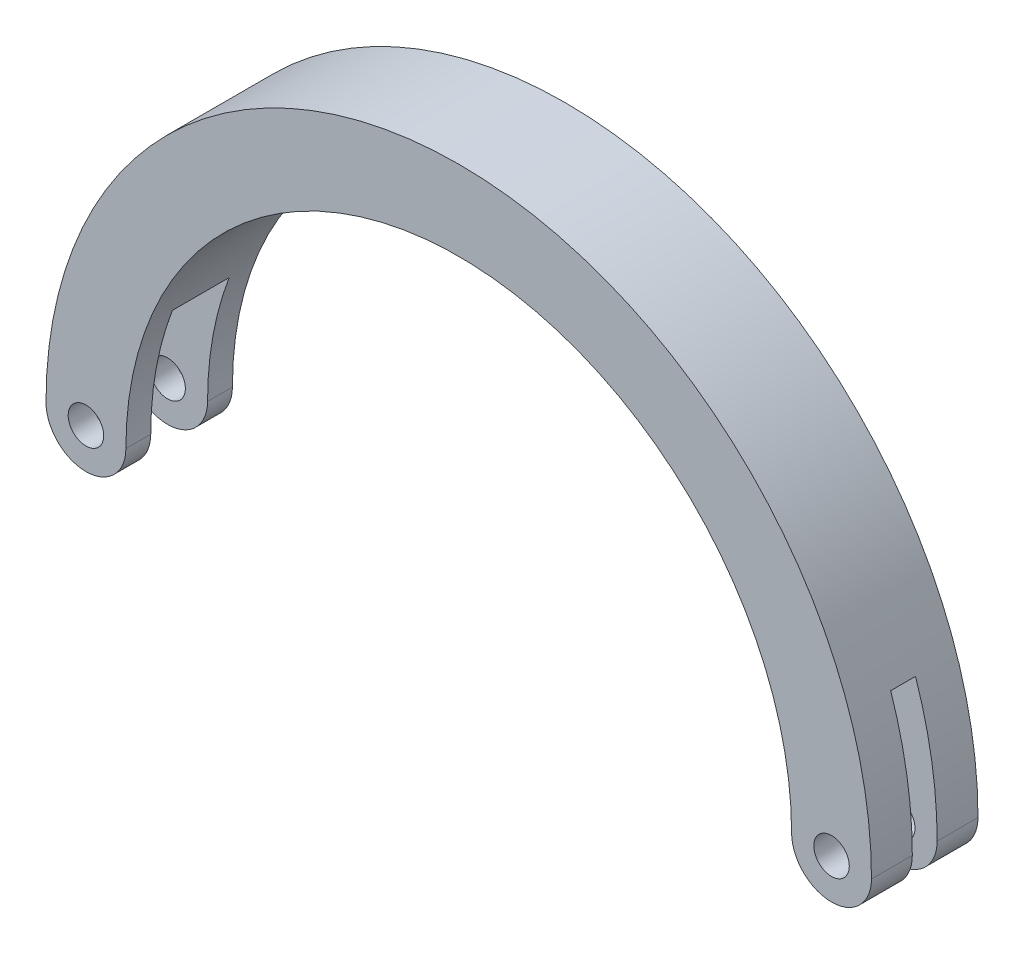
ISO-10303-21;
HEADER;
FILE_DESCRIPTION(('STEP AP214'),'2;1');
FILE_NAME('part.step','',(''),(''),'','','');
FILE_SCHEMA(('AUTOMOTIVE_DESIGN { 1 0 10303 214 1 1 1 1 }'));
ENDSEC;
DATA;
#1=APPLICATION_CONTEXT('core data for automotive mechanical design processes');
#2=APPLICATION_PROTOCOL_DEFINITION('international standard','automotive_design',2000,#1);
#3=PRODUCT_CONTEXT('',#1,'mechanical');
#4=PRODUCT('Part','Part','',(#3));
#5=PRODUCT_RELATED_PRODUCT_CATEGORY('part','',(#4));
#6=PRODUCT_DEFINITION_FORMATION('','',#4);
#7=PRODUCT_DEFINITION_CONTEXT('part definition',#1,'design');
#8=PRODUCT_DEFINITION('design','',#6,#7);
#9=PRODUCT_DEFINITION_SHAPE('','',#8);
#10=(LENGTH_UNIT() NAMED_UNIT(*) SI_UNIT(.MILLI.,.METRE.));
#11=(NAMED_UNIT(*) PLANE_ANGLE_UNIT() SI_UNIT($,.RADIAN.));
#12=(NAMED_UNIT(*) SI_UNIT($,.STERADIAN.) SOLID_ANGLE_UNIT());
#13=UNCERTAINTY_MEASURE_WITH_UNIT(LENGTH_MEASURE(1.E-05),#10,'distance_accuracy_value','');
#14=(GEOMETRIC_REPRESENTATION_CONTEXT(3) GLOBAL_UNCERTAINTY_ASSIGNED_CONTEXT((#13)) GLOBAL_UNIT_ASSIGNED_CONTEXT((#10,
#11,#12)) REPRESENTATION_CONTEXT('',''));
#15=CARTESIAN_POINT('',(0.,0.,0.));
#16=DIRECTION('',(0.,0.,1.));
#17=DIRECTION('',(1.,0.,0.));
#18=AXIS2_PLACEMENT_3D('',#15,#16,#17);
#19=CARTESIAN_POINT('',(42.,0.,-3.));
#20=DIRECTION('',(0.,0.,1.));
#21=DIRECTION('',(1.,0.,0.));
#22=AXIS2_PLACEMENT_3D('',#19,#20,#21);
#23=CYLINDRICAL_SURFACE('',#22,2.25);
#24=DIRECTION('',(0.,0.,1.));
#25=VECTOR('',#24,1.);
#26=CARTESIAN_POINT('',(44.25,0.,-3.));
#27=LINE('',#26,#25);
#28=CARTESIAN_POINT('',(44.25,0.,-3.));
#29=VERTEX_POINT('',#28);
#30=CARTESIAN_POINT('',(44.25,0.,-0.7));
#31=VERTEX_POINT('',#30);
#32=EDGE_CURVE('E217',#29,#31,#27,.T.);
#33=ORIENTED_EDGE('',*,*,#32,.T.);
#34=CARTESIAN_POINT('',(42.,0.,-0.7));
#35=DIRECTION('',(0.,0.,1.));
#36=DIRECTION('',(1.,0.,0.));
#37=AXIS2_PLACEMENT_3D('',#34,#35,#36);
#38=CIRCLE('',#37,2.25);
#39=CARTESIAN_POINT('',(39.75,0.,-0.7));
#40=VERTEX_POINT('',#39);
#41=EDGE_CURVE('E130',#31,#40,#38,.F.);
#42=ORIENTED_EDGE('',*,*,#41,.T.);
#43=DIRECTION('',(0.,0.,1.));
#44=VECTOR('',#43,1.);
#45=CARTESIAN_POINT('',(39.75,0.,-3.));
#46=LINE('',#45,#44);
#47=CARTESIAN_POINT('',(39.75,0.,-3.));
#48=VERTEX_POINT('',#47);
#49=EDGE_CURVE('E220',#48,#40,#46,.T.);
#50=ORIENTED_EDGE('',*,*,#49,.F.);
#51=CARTESIAN_POINT('',(42.,0.,-3.));
#52=DIRECTION('',(0.,0.,1.));
#53=DIRECTION('',(1.,0.,0.));
#54=AXIS2_PLACEMENT_3D('',#51,#52,#53);
#55=CIRCLE('',#54,2.25);
#56=EDGE_CURVE('E200',#48,#29,#55,.T.);
#57=ORIENTED_EDGE('',*,*,#56,.T.);
#58=EDGE_LOOP('',(#33,#42,#50,#57));
#59=FACE_BOUND('',#58,.T.);
#60=ADVANCED_FACE('F40',(#59),#23,.T.);
#61=CARTESIAN_POINT('',(42.,0.,-3.));
#62=DIRECTION('',(0.,0.,1.));
#63=DIRECTION('',(1.,0.,0.));
#64=AXIS2_PLACEMENT_3D('',#61,#62,#63);
#65=CYLINDRICAL_SURFACE('',#64,0.999999999999998);
#66=CARTESIAN_POINT('',(42.,0.,-3.));
#67=DIRECTION('',(0.,0.,1.));
#68=DIRECTION('',(1.,0.,0.));
#69=AXIS2_PLACEMENT_3D('',#66,#67,#68);
#70=CIRCLE('',#69,0.999999999999998);
#71=CARTESIAN_POINT('',(43.,0.,-3.));
#72=VERTEX_POINT('',#71);
#73=EDGE_CURVE('E208',#72,#72,#70,.T.);
#74=ORIENTED_EDGE('',*,*,#73,.F.);
#75=EDGE_LOOP('',(#74));
#76=FACE_BOUND('',#75,.T.);
#77=CARTESIAN_POINT('',(42.,0.,-0.7));
#78=DIRECTION('',(0.,0.,1.));
#79=DIRECTION('',(1.,0.,0.));
#80=AXIS2_PLACEMENT_3D('',#77,#78,#79);
#81=CIRCLE('',#80,0.999999999999998);
#82=CARTESIAN_POINT('',(43.,0.,-0.7));
#83=VERTEX_POINT('',#82);
#84=EDGE_CURVE('E232',#83,#83,#81,.F.);
#85=ORIENTED_EDGE('',*,*,#84,.F.);
#86=EDGE_LOOP('',(#85));
#87=FACE_BOUND('',#86,.T.);
#88=ADVANCED_FACE('F294',(#76,#87),#65,.F.);
#89=CARTESIAN_POINT('',(0.,0.,-3.));
#90=DIRECTION('',(0.,0.,1.));
#91=DIRECTION('',(1.,0.,0.));
#92=AXIS2_PLACEMENT_3D('',#89,#90,#91);
#93=CYLINDRICAL_SURFACE('',#92,2.25);
#94=DIRECTION('',(0.,0.,1.));
#95=VECTOR('',#94,1.);
#96=CARTESIAN_POINT('',(2.25,0.,-3.));
#97=LINE('',#96,#95);
#98=CARTESIAN_POINT('',(2.25,0.,-3.));
#99=VERTEX_POINT('',#98);
#100=CARTESIAN_POINT('',(2.25,0.,-1.6));
#101=VERTEX_POINT('',#100);
#102=EDGE_CURVE('E224',#99,#101,#97,.T.);
#103=ORIENTED_EDGE('',*,*,#102,.T.);
#104=CARTESIAN_POINT('',(0.,0.,-1.6));
#105=DIRECTION('',(0.,0.,1.));
#106=DIRECTION('',(1.,0.,0.));
#107=AXIS2_PLACEMENT_3D('',#104,#105,#106);
#108=CIRCLE('',#107,2.25);
#109=CARTESIAN_POINT('',(-2.25,0.,-1.6));
#110=VERTEX_POINT('',#109);
#111=EDGE_CURVE('E63',#101,#110,#108,.F.);
#112=ORIENTED_EDGE('',*,*,#111,.T.);
#113=DIRECTION('',(0.,0.,1.));
#114=VECTOR('',#113,1.);
#115=CARTESIAN_POINT('',(-2.25,0.,-3.));
#116=LINE('',#115,#114);
#117=CARTESIAN_POINT('',(-2.25,0.,-3.));
#118=VERTEX_POINT('',#117);
#119=EDGE_CURVE('E212',#118,#110,#116,.T.);
#120=ORIENTED_EDGE('',*,*,#119,.F.);
#121=CARTESIAN_POINT('',(0.,0.,-3.));
#122=DIRECTION('',(0.,0.,1.));
#123=DIRECTION('',(1.,0.,0.));
#124=AXIS2_PLACEMENT_3D('',#121,#122,#123);
#125=CIRCLE('',#124,2.25);
#126=EDGE_CURVE('E194',#118,#99,#125,.T.);
#127=ORIENTED_EDGE('',*,*,#126,.T.);
#128=EDGE_LOOP('',(#103,#112,#120,#127));
#129=FACE_BOUND('',#128,.T.);
#130=ADVANCED_FACE('F258',(#129),#93,.T.);
#131=CARTESIAN_POINT('',(0.,0.,-3.));
#132=DIRECTION('',(0.,0.,1.));
#133=DIRECTION('',(1.,0.,0.));
#134=AXIS2_PLACEMENT_3D('',#131,#132,#133);
#135=CYLINDRICAL_SURFACE('',#134,1.);
#136=CARTESIAN_POINT('',(0.,0.,-3.));
#137=DIRECTION('',(0.,0.,1.));
#138=DIRECTION('',(1.,0.,0.));
#139=AXIS2_PLACEMENT_3D('',#136,#137,#138);
#140=CIRCLE('',#139,1.);
#141=CARTESIAN_POINT('',(1.,0.,-3.));
#142=VERTEX_POINT('',#141);
#143=EDGE_CURVE('E205',#142,#142,#140,.T.);
#144=ORIENTED_EDGE('',*,*,#143,.F.);
#145=EDGE_LOOP('',(#144));
#146=FACE_BOUND('',#145,.T.);
#147=CARTESIAN_POINT('',(0.,0.,-1.6));
#148=DIRECTION('',(0.,0.,1.));
#149=DIRECTION('',(1.,0.,0.));
#150=AXIS2_PLACEMENT_3D('',#147,#148,#149);
#151=CIRCLE('',#150,1.);
#152=CARTESIAN_POINT('',(1.,0.,-1.6));
#153=VERTEX_POINT('',#152);
#154=EDGE_CURVE('E163',#153,#153,#151,.F.);
#155=ORIENTED_EDGE('',*,*,#154,.F.);
#156=EDGE_LOOP('',(#155));
#157=FACE_BOUND('',#156,.T.);
#158=ADVANCED_FACE('F311',(#146,#157),#135,.F.);
#159=CARTESIAN_POINT('',(0.,0.,1.6));
#160=DIRECTION('',(0.,0.,1.));
#161=DIRECTION('',(1.,0.,0.));
#162=AXIS2_PLACEMENT_3D('',#159,#160,#161);
#163=CIRCLE('',#162,2.25);
#164=CARTESIAN_POINT('',(2.25,0.,1.6));
#165=VERTEX_POINT('',#164);
#166=CARTESIAN_POINT('',(-2.25,0.,1.6));
#167=VERTEX_POINT('',#166);
#168=EDGE_CURVE('E166',#165,#167,#163,.F.);
#169=ORIENTED_EDGE('',*,*,#168,.F.);
#170=CARTESIAN_POINT('',(2.25,0.,3.));
#171=VERTEX_POINT('',#170);
#172=EDGE_CURVE('E211',#165,#171,#97,.T.);
#173=ORIENTED_EDGE('',*,*,#172,.T.);
#174=CARTESIAN_POINT('',(0.,0.,3.));
#175=DIRECTION('',(0.,0.,1.));
#176=DIRECTION('',(1.,0.,0.));
#177=AXIS2_PLACEMENT_3D('',#174,#175,#176);
#178=CIRCLE('',#177,2.25);
#179=CARTESIAN_POINT('',(-2.25,0.,3.));
#180=VERTEX_POINT('',#179);
#181=EDGE_CURVE('E176',#180,#171,#178,.T.);
#182=ORIENTED_EDGE('',*,*,#181,.F.);
#183=EDGE_CURVE('E216',#167,#180,#116,.T.);
#184=ORIENTED_EDGE('',*,*,#183,.F.);
#185=EDGE_LOOP('',(#169,#173,#182,#184));
#186=FACE_BOUND('',#185,.T.);
#187=ADVANCED_FACE('F42',(#186),#93,.T.);
#188=CARTESIAN_POINT('',(21.,0.,-3.));
#189=DIRECTION('',(0.,0.,1.));
#190=DIRECTION('',(1.,0.,0.));
#191=AXIS2_PLACEMENT_3D('',#188,#189,#190);
#192=CYLINDRICAL_SURFACE('',#191,23.25);
#193=CARTESIAN_POINT('',(44.25,0.,0.7));
#194=VERTEX_POINT('',#193);
#195=CARTESIAN_POINT('',(44.25,0.,3.));
#196=VERTEX_POINT('',#195);
#197=EDGE_CURVE('E219',#194,#196,#27,.T.);
#198=ORIENTED_EDGE('',*,*,#197,.F.);
#199=CARTESIAN_POINT('',(21.,0.,0.7));
#200=DIRECTION('',(0.,0.,1.));
#201=DIRECTION('',(1.,0.,0.));
#202=AXIS2_PLACEMENT_3D('',#199,#200,#201);
#203=CIRCLE('',#202,23.25);
#204=CARTESIAN_POINT('',(43.03125,7.42876325087158,0.7));
#205=VERTEX_POINT('',#204);
#206=EDGE_CURVE('E148',#194,#205,#203,.T.);
#207=ORIENTED_EDGE('',*,*,#206,.T.);
#208=DIRECTION('',(0.,0.,-1.));
#209=VECTOR('',#208,1.);
#210=CARTESIAN_POINT('',(43.03125,7.42876325087158,0.));
#211=LINE('',#210,#209);
#212=CARTESIAN_POINT('',(43.03125,7.42876325087158,-0.7));
#213=VERTEX_POINT('',#212);
#214=EDGE_CURVE('E140',#213,#205,#211,.F.);
#215=ORIENTED_EDGE('',*,*,#214,.F.);
#216=CARTESIAN_POINT('',(21.,0.,-0.7));
#217=DIRECTION('',(0.,0.,1.));
#218=DIRECTION('',(1.,0.,0.));
#219=AXIS2_PLACEMENT_3D('',#216,#217,#218);
#220=CIRCLE('',#219,23.25);
#221=EDGE_CURVE('E127',#31,#213,#220,.T.);
#222=ORIENTED_EDGE('',*,*,#221,.F.);
#223=ORIENTED_EDGE('',*,*,#32,.F.);
#224=CARTESIAN_POINT('',(21.,0.,-3.));
#225=DIRECTION('',(0.,0.,1.));
#226=DIRECTION('',(1.,0.,0.));
#227=AXIS2_PLACEMENT_3D('',#224,#225,#226);
#228=CIRCLE('',#227,23.25);
#229=EDGE_CURVE('E203',#118,#29,#228,.F.);
#230=ORIENTED_EDGE('',*,*,#229,.F.);
#231=ORIENTED_EDGE('',*,*,#119,.T.);
#232=CARTESIAN_POINT('',(21.,0.,-1.6));
#233=DIRECTION('',(0.,0.,1.));
#234=DIRECTION('',(1.,0.,0.));
#235=AXIS2_PLACEMENT_3D('',#232,#233,#234);
#236=CIRCLE('',#235,23.25);
#237=CARTESIAN_POINT('',(-1.03125,7.42876325087157,-1.6));
#238=VERTEX_POINT('',#237);
#239=EDGE_CURVE('E161',#238,#110,#236,.T.);
#240=ORIENTED_EDGE('',*,*,#239,.F.);
#241=DIRECTION('',(0.,0.,-1.));
#242=VECTOR('',#241,1.);
#243=CARTESIAN_POINT('',(-1.03125,7.42876325087157,0.));
#244=LINE('',#243,#242);
#245=CARTESIAN_POINT('',(-1.03125,7.42876325087157,1.6));
#246=VERTEX_POINT('',#245);
#247=EDGE_CURVE('E174',#246,#238,#244,.T.);
#248=ORIENTED_EDGE('',*,*,#247,.F.);
#249=CARTESIAN_POINT('',(21.,0.,1.6));
#250=DIRECTION('',(0.,0.,1.));
#251=DIRECTION('',(1.,0.,0.));
#252=AXIS2_PLACEMENT_3D('',#249,#250,#251);
#253=CIRCLE('',#252,23.25);
#254=EDGE_CURVE('E168',#246,#167,#253,.T.);
#255=ORIENTED_EDGE('',*,*,#254,.T.);
#256=ORIENTED_EDGE('',*,*,#183,.T.);
#257=CARTESIAN_POINT('',(21.,0.,3.));
#258=DIRECTION('',(0.,0.,1.));
#259=DIRECTION('',(1.,0.,0.));
#260=AXIS2_PLACEMENT_3D('',#257,#258,#259);
#261=CIRCLE('',#260,23.25);
#262=EDGE_CURVE('E185',#180,#196,#261,.F.);
#263=ORIENTED_EDGE('',*,*,#262,.T.);
#264=EDGE_LOOP('',(#198,#207,#215,#222,#223,#230,#231,#240,#248,#255,#256,#263));
#265=FACE_BOUND('',#264,.T.);
#266=ADVANCED_FACE('F147',(#265),#192,.T.);
#267=CARTESIAN_POINT('',(42.,0.,0.7));
#268=DIRECTION('',(0.,0.,1.));
#269=DIRECTION('',(1.,0.,0.));
#270=AXIS2_PLACEMENT_3D('',#267,#268,#269);
#271=CIRCLE('',#270,2.25);
#272=CARTESIAN_POINT('',(39.75,0.,0.7));
#273=VERTEX_POINT('',#272);
#274=EDGE_CURVE('E154',#194,#273,#271,.F.);
#275=ORIENTED_EDGE('',*,*,#274,.F.);
#276=ORIENTED_EDGE('',*,*,#197,.T.);
#277=CARTESIAN_POINT('',(42.,0.,3.));
#278=DIRECTION('',(0.,0.,1.));
#279=DIRECTION('',(1.,0.,0.));
#280=AXIS2_PLACEMENT_3D('',#277,#278,#279);
#281=CIRCLE('',#280,2.25);
#282=CARTESIAN_POINT('',(39.75,0.,3.));
#283=VERTEX_POINT('',#282);
#284=EDGE_CURVE('E182',#283,#196,#281,.T.);
#285=ORIENTED_EDGE('',*,*,#284,.F.);
#286=EDGE_CURVE('E223',#273,#283,#46,.T.);
#287=ORIENTED_EDGE('',*,*,#286,.F.);
#288=EDGE_LOOP('',(#275,#276,#285,#287));
#289=FACE_BOUND('',#288,.T.);
#290=ADVANCED_FACE('F281',(#289),#23,.T.);
#291=CARTESIAN_POINT('',(0.,0.,1.6));
#292=DIRECTION('',(0.,0.,1.));
#293=DIRECTION('',(1.,0.,0.));
#294=AXIS2_PLACEMENT_3D('',#291,#292,#293);
#295=CIRCLE('',#294,1.);
#296=CARTESIAN_POINT('',(1.,0.,1.6));
#297=VERTEX_POINT('',#296);
#298=EDGE_CURVE('E171',#297,#297,#295,.F.);
#299=ORIENTED_EDGE('',*,*,#298,.T.);
#300=EDGE_LOOP('',(#299));
#301=FACE_BOUND('',#300,.T.);
#302=CARTESIAN_POINT('',(0.,0.,3.));
#303=DIRECTION('',(0.,0.,1.));
#304=DIRECTION('',(1.,0.,0.));
#305=AXIS2_PLACEMENT_3D('',#302,#303,#304);
#306=CIRCLE('',#305,1.);
#307=CARTESIAN_POINT('',(1.,0.,3.));
#308=VERTEX_POINT('',#307);
#309=EDGE_CURVE('E188',#308,#308,#306,.T.);
#310=ORIENTED_EDGE('',*,*,#309,.T.);
#311=EDGE_LOOP('',(#310));
#312=FACE_BOUND('',#311,.T.);
#313=ADVANCED_FACE('F304',(#301,#312),#135,.F.);
#314=CARTESIAN_POINT('',(21.,0.,-3.));
#315=DIRECTION('',(0.,0.,1.));
#316=DIRECTION('',(1.,0.,0.));
#317=AXIS2_PLACEMENT_3D('',#314,#315,#316);
#318=CYLINDRICAL_SURFACE('',#317,18.75);
#319=CARTESIAN_POINT('',(21.,0.,0.7));
#320=DIRECTION('',(0.,0.,1.));
#321=DIRECTION('',(1.,0.,0.));
#322=AXIS2_PLACEMENT_3D('',#319,#320,#321);
#323=CIRCLE('',#322,18.75);
#324=CARTESIAN_POINT('',(38.53125,6.64964460986451,0.7));
#325=VERTEX_POINT('',#324);
#326=EDGE_CURVE('E236',#273,#325,#323,.T.);
#327=ORIENTED_EDGE('',*,*,#326,.F.);
#328=ORIENTED_EDGE('',*,*,#286,.T.);
#329=CARTESIAN_POINT('',(21.,0.,3.));
#330=DIRECTION('',(0.,0.,1.));
#331=DIRECTION('',(1.,0.,0.));
#332=AXIS2_PLACEMENT_3D('',#329,#330,#331);
#333=CIRCLE('',#332,18.75);
#334=EDGE_CURVE('E179',#171,#283,#333,.F.);
#335=ORIENTED_EDGE('',*,*,#334,.F.);
#336=ORIENTED_EDGE('',*,*,#172,.F.);
#337=CARTESIAN_POINT('',(21.,0.,1.6));
#338=DIRECTION('',(0.,0.,1.));
#339=DIRECTION('',(1.,0.,0.));
#340=AXIS2_PLACEMENT_3D('',#337,#338,#339);
#341=CIRCLE('',#340,18.75);
#342=CARTESIAN_POINT('',(3.46875,6.6496446098645,1.6));
#343=VERTEX_POINT('',#342);
#344=EDGE_CURVE('E48',#343,#165,#341,.T.);
#345=ORIENTED_EDGE('',*,*,#344,.F.);
#346=DIRECTION('',(0.,0.,-1.));
#347=VECTOR('',#346,1.);
#348=CARTESIAN_POINT('',(3.46875,6.6496446098645,0.));
#349=LINE('',#348,#347);
#350=CARTESIAN_POINT('',(3.46875,6.6496446098645,-1.6));
#351=VERTEX_POINT('',#350);
#352=EDGE_CURVE('E228',#343,#351,#349,.T.);
#353=ORIENTED_EDGE('',*,*,#352,.T.);
#354=CARTESIAN_POINT('',(21.,0.,-1.6));
#355=DIRECTION('',(0.,0.,1.));
#356=DIRECTION('',(1.,0.,0.));
#357=AXIS2_PLACEMENT_3D('',#354,#355,#356);
#358=CIRCLE('',#357,18.75);
#359=EDGE_CURVE('E215',#351,#101,#358,.T.);
#360=ORIENTED_EDGE('',*,*,#359,.T.);
#361=ORIENTED_EDGE('',*,*,#102,.F.);
#362=CARTESIAN_POINT('',(21.,0.,-3.));
#363=DIRECTION('',(0.,0.,1.));
#364=DIRECTION('',(1.,0.,0.));
#365=AXIS2_PLACEMENT_3D('',#362,#363,#364);
#366=CIRCLE('',#365,18.75);
#367=EDGE_CURVE('E197',#99,#48,#366,.F.);
#368=ORIENTED_EDGE('',*,*,#367,.T.);
#369=ORIENTED_EDGE('',*,*,#49,.T.);
#370=CARTESIAN_POINT('',(21.,0.,-0.7));
#371=DIRECTION('',(0.,0.,1.));
#372=DIRECTION('',(1.,0.,0.));
#373=AXIS2_PLACEMENT_3D('',#370,#371,#372);
#374=CIRCLE('',#373,18.75);
#375=CARTESIAN_POINT('',(38.53125,6.64964460986451,-0.7));
#376=VERTEX_POINT('',#375);
#377=EDGE_CURVE('E234',#40,#376,#374,.T.);
#378=ORIENTED_EDGE('',*,*,#377,.T.);
#379=DIRECTION('',(0.,0.,-1.));
#380=VECTOR('',#379,1.);
#381=CARTESIAN_POINT('',(38.53125,6.64964460986451,0.));
#382=LINE('',#381,#380);
#383=EDGE_CURVE('E11',#376,#325,#382,.F.);
#384=ORIENTED_EDGE('',*,*,#383,.T.);
#385=EDGE_LOOP('',(#327,#328,#335,#336,#345,#353,#360,#361,#368,#369,#378,#384));
#386=FACE_BOUND('',#385,.T.);
#387=ADVANCED_FACE('F246',(#386),#318,.F.);
#388=CARTESIAN_POINT('',(42.,0.,0.7));
#389=DIRECTION('',(0.,0.,1.));
#390=DIRECTION('',(1.,0.,0.));
#391=AXIS2_PLACEMENT_3D('',#388,#389,#390);
#392=CIRCLE('',#391,0.999999999999998);
#393=CARTESIAN_POINT('',(43.,0.,0.7));
#394=VERTEX_POINT('',#393);
#395=EDGE_CURVE('E135',#394,#394,#392,.F.);
#396=ORIENTED_EDGE('',*,*,#395,.T.);
#397=EDGE_LOOP('',(#396));
#398=FACE_BOUND('',#397,.T.);
#399=CARTESIAN_POINT('',(42.,0.,3.));
#400=DIRECTION('',(0.,0.,1.));
#401=DIRECTION('',(1.,0.,0.));
#402=AXIS2_PLACEMENT_3D('',#399,#400,#401);
#403=CIRCLE('',#402,0.999999999999998);
#404=CARTESIAN_POINT('',(43.,0.,3.));
#405=VERTEX_POINT('',#404);
#406=EDGE_CURVE('E191',#405,#405,#403,.T.);
#407=ORIENTED_EDGE('',*,*,#406,.T.);
#408=EDGE_LOOP('',(#407));
#409=FACE_BOUND('',#408,.T.);
#410=ADVANCED_FACE('F301',(#398,#409),#65,.F.);
#411=CARTESIAN_POINT('',(0.,0.,-3.));
#412=DIRECTION('',(0.,0.,1.));
#413=DIRECTION('',(1.,0.,0.));
#414=AXIS2_PLACEMENT_3D('',#411,#412,#413);
#415=PLANE('',#414);
#416=ORIENTED_EDGE('',*,*,#126,.F.);
#417=ORIENTED_EDGE('',*,*,#229,.T.);
#418=ORIENTED_EDGE('',*,*,#56,.F.);
#419=ORIENTED_EDGE('',*,*,#367,.F.);
#420=EDGE_LOOP('',(#416,#417,#418,#419));
#421=FACE_BOUND('',#420,.T.);
#422=ORIENTED_EDGE('',*,*,#143,.T.);
#423=EDGE_LOOP('',(#422));
#424=FACE_BOUND('',#423,.T.);
#425=ORIENTED_EDGE('',*,*,#73,.T.);
#426=EDGE_LOOP('',(#425));
#427=FACE_BOUND('',#426,.T.);
#428=ADVANCED_FACE('F255',(#421,#424,#427),#415,.F.);
#429=CARTESIAN_POINT('',(0.,0.,3.));
#430=DIRECTION('',(0.,0.,1.));
#431=DIRECTION('',(1.,0.,0.));
#432=AXIS2_PLACEMENT_3D('',#429,#430,#431);
#433=PLANE('',#432);
#434=ORIENTED_EDGE('',*,*,#181,.T.);
#435=ORIENTED_EDGE('',*,*,#334,.T.);
#436=ORIENTED_EDGE('',*,*,#284,.T.);
#437=ORIENTED_EDGE('',*,*,#262,.F.);
#438=EDGE_LOOP('',(#434,#435,#436,#437));
#439=FACE_BOUND('',#438,.T.);
#440=ORIENTED_EDGE('',*,*,#309,.F.);
#441=EDGE_LOOP('',(#440));
#442=FACE_BOUND('',#441,.T.);
#443=ORIENTED_EDGE('',*,*,#406,.F.);
#444=EDGE_LOOP('',(#443));
#445=FACE_BOUND('',#444,.T.);
#446=ADVANCED_FACE('F276',(#439,#442,#445),#433,.T.);
#447=CARTESIAN_POINT('',(0.,0.,1.6));
#448=DIRECTION('',(0.,0.,-1.));
#449=DIRECTION('',(-1.,0.,0.));
#450=AXIS2_PLACEMENT_3D('',#447,#448,#449);
#451=CYLINDRICAL_SURFACE('',#450,7.5);
#452=ORIENTED_EDGE('',*,*,#247,.T.);
#453=CARTESIAN_POINT('',(0.,0.,-1.6));
#454=DIRECTION('',(0.,0.,1.));
#455=DIRECTION('',(1.,0.,0.));
#456=AXIS2_PLACEMENT_3D('',#453,#454,#455);
#457=CIRCLE('',#456,7.5);
#458=EDGE_CURVE('E149',#351,#238,#457,.T.);
#459=ORIENTED_EDGE('',*,*,#458,.F.);
#460=ORIENTED_EDGE('',*,*,#352,.F.);
#461=CARTESIAN_POINT('',(0.,0.,1.6));
#462=DIRECTION('',(0.,0.,1.));
#463=DIRECTION('',(1.,0.,0.));
#464=AXIS2_PLACEMENT_3D('',#461,#462,#463);
#465=CIRCLE('',#464,7.5);
#466=EDGE_CURVE('E152',#343,#246,#465,.T.);
#467=ORIENTED_EDGE('',*,*,#466,.T.);
#468=EDGE_LOOP('',(#452,#459,#460,#467));
#469=FACE_BOUND('',#468,.T.);
#470=ADVANCED_FACE('F264',(#469),#451,.F.);
#471=CARTESIAN_POINT('',(0.,0.,1.6));
#472=DIRECTION('',(0.,0.,1.));
#473=DIRECTION('',(1.,0.,0.));
#474=AXIS2_PLACEMENT_3D('',#471,#472,#473);
#475=PLANE('',#474);
#476=ORIENTED_EDGE('',*,*,#466,.F.);
#477=ORIENTED_EDGE('',*,*,#344,.T.);
#478=ORIENTED_EDGE('',*,*,#168,.T.);
#479=ORIENTED_EDGE('',*,*,#254,.F.);
#480=EDGE_LOOP('',(#476,#477,#478,#479));
#481=FACE_BOUND('',#480,.T.);
#482=ORIENTED_EDGE('',*,*,#298,.F.);
#483=EDGE_LOOP('',(#482));
#484=FACE_BOUND('',#483,.T.);
#485=ADVANCED_FACE('F323',(#481,#484),#475,.F.);
#486=CARTESIAN_POINT('',(0.,0.,-1.6));
#487=DIRECTION('',(0.,0.,1.));
#488=DIRECTION('',(1.,0.,0.));
#489=AXIS2_PLACEMENT_3D('',#486,#487,#488);
#490=PLANE('',#489);
#491=ORIENTED_EDGE('',*,*,#239,.T.);
#492=ORIENTED_EDGE('',*,*,#111,.F.);
#493=ORIENTED_EDGE('',*,*,#359,.F.);
#494=ORIENTED_EDGE('',*,*,#458,.T.);
#495=EDGE_LOOP('',(#491,#492,#493,#494));
#496=FACE_BOUND('',#495,.T.);
#497=ORIENTED_EDGE('',*,*,#154,.T.);
#498=EDGE_LOOP('',(#497));
#499=FACE_BOUND('',#498,.T.);
#500=ADVANCED_FACE('F261',(#496,#499),#490,.T.);
#501=CARTESIAN_POINT('',(42.,0.,0.7));
#502=DIRECTION('',(0.,0.,-1.));
#503=DIRECTION('',(-1.,0.,0.));
#504=AXIS2_PLACEMENT_3D('',#501,#502,#503);
#505=CYLINDRICAL_SURFACE('',#504,7.5);
#506=ORIENTED_EDGE('',*,*,#214,.T.);
#507=CARTESIAN_POINT('',(42.,0.,0.7));
#508=DIRECTION('',(0.,0.,1.));
#509=DIRECTION('',(1.,0.,0.));
#510=AXIS2_PLACEMENT_3D('',#507,#508,#509);
#511=CIRCLE('',#510,7.5);
#512=EDGE_CURVE('E143',#205,#325,#511,.T.);
#513=ORIENTED_EDGE('',*,*,#512,.T.);
#514=ORIENTED_EDGE('',*,*,#383,.F.);
#515=CARTESIAN_POINT('',(42.,0.,-0.7));
#516=DIRECTION('',(0.,0.,1.));
#517=DIRECTION('',(1.,0.,0.));
#518=AXIS2_PLACEMENT_3D('',#515,#516,#517);
#519=CIRCLE('',#518,7.5);
#520=EDGE_CURVE('E55',#213,#376,#519,.T.);
#521=ORIENTED_EDGE('',*,*,#520,.F.);
#522=EDGE_LOOP('',(#506,#513,#514,#521));
#523=FACE_BOUND('',#522,.T.);
#524=ADVANCED_FACE('F138',(#523),#505,.F.);
#525=CARTESIAN_POINT('',(42.,0.,0.7));
#526=DIRECTION('',(0.,0.,1.));
#527=DIRECTION('',(1.,0.,0.));
#528=AXIS2_PLACEMENT_3D('',#525,#526,#527);
#529=PLANE('',#528);
#530=ORIENTED_EDGE('',*,*,#395,.F.);
#531=EDGE_LOOP('',(#530));
#532=FACE_BOUND('',#531,.T.);
#533=ORIENTED_EDGE('',*,*,#274,.T.);
#534=ORIENTED_EDGE('',*,*,#326,.T.);
#535=ORIENTED_EDGE('',*,*,#512,.F.);
#536=ORIENTED_EDGE('',*,*,#206,.F.);
#537=EDGE_LOOP('',(#533,#534,#535,#536));
#538=FACE_BOUND('',#537,.T.);
#539=ADVANCED_FACE('F282',(#532,#538),#529,.F.);
#540=CARTESIAN_POINT('',(42.,0.,-0.7));
#541=DIRECTION('',(0.,0.,1.));
#542=DIRECTION('',(1.,0.,0.));
#543=AXIS2_PLACEMENT_3D('',#540,#541,#542);
#544=PLANE('',#543);
#545=ORIENTED_EDGE('',*,*,#84,.T.);
#546=EDGE_LOOP('',(#545));
#547=FACE_BOUND('',#546,.T.);
#548=ORIENTED_EDGE('',*,*,#221,.T.);
#549=ORIENTED_EDGE('',*,*,#520,.T.);
#550=ORIENTED_EDGE('',*,*,#377,.F.);
#551=ORIENTED_EDGE('',*,*,#41,.F.);
#552=EDGE_LOOP('',(#548,#549,#550,#551));
#553=FACE_BOUND('',#552,.T.);
#554=ADVANCED_FACE('F128',(#547,#553),#544,.T.);
#555=CLOSED_SHELL('',(#60,#88,#130,#158,#187,#266,#290,#313,#387,#410,#428,#446,#470,#485,#500,
#524,#539,#554));
#556=MANIFOLD_SOLID_BREP('B2',#555);
#557=ADVANCED_BREP_SHAPE_REPRESENTATION('',(#18,#556),#14);
#558=SHAPE_DEFINITION_REPRESENTATION(#9,#557);
ENDSEC;
END-ISO-10303-21;
